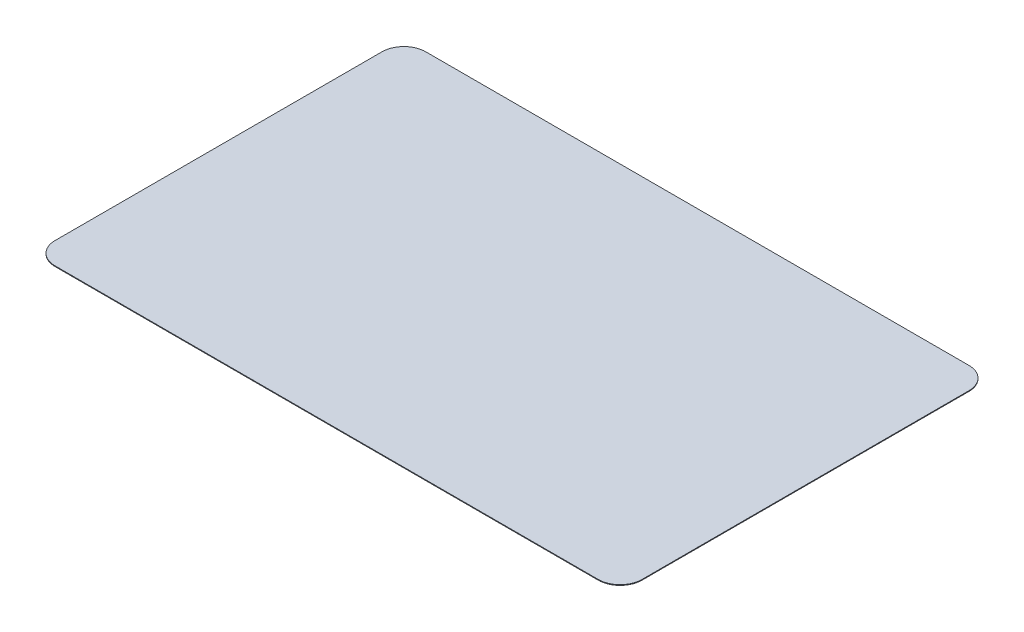
ISO-10303-21;
HEADER;
FILE_DESCRIPTION(('STEP AP214'),'2;1');
FILE_NAME('part.step','',(''),(''),'','','');
FILE_SCHEMA(('AUTOMOTIVE_DESIGN { 1 0 10303 214 1 1 1 1 }'));
ENDSEC;
DATA;
#1=APPLICATION_CONTEXT('core data for automotive mechanical design processes');
#2=APPLICATION_PROTOCOL_DEFINITION('international standard','automotive_design',2000,#1);
#3=PRODUCT_CONTEXT('',#1,'mechanical');
#4=PRODUCT('Part','Part','',(#3));
#5=PRODUCT_RELATED_PRODUCT_CATEGORY('part','',(#4));
#6=PRODUCT_DEFINITION_FORMATION('','',#4);
#7=PRODUCT_DEFINITION_CONTEXT('part definition',#1,'design');
#8=PRODUCT_DEFINITION('design','',#6,#7);
#9=PRODUCT_DEFINITION_SHAPE('','',#8);
#10=(LENGTH_UNIT() NAMED_UNIT(*) SI_UNIT(.MILLI.,.METRE.));
#11=(NAMED_UNIT(*) PLANE_ANGLE_UNIT() SI_UNIT($,.RADIAN.));
#12=(NAMED_UNIT(*) SI_UNIT($,.STERADIAN.) SOLID_ANGLE_UNIT());
#13=UNCERTAINTY_MEASURE_WITH_UNIT(LENGTH_MEASURE(1.E-05),#10,'distance_accuracy_value','');
#14=(GEOMETRIC_REPRESENTATION_CONTEXT(3) GLOBAL_UNCERTAINTY_ASSIGNED_CONTEXT((#13)) GLOBAL_UNIT_ASSIGNED_CONTEXT((#10,
#11,#12)) REPRESENTATION_CONTEXT('',''));
#15=CARTESIAN_POINT('',(0.,0.,0.));
#16=DIRECTION('',(0.,0.,1.));
#17=DIRECTION('',(1.,0.,0.));
#18=AXIS2_PLACEMENT_3D('',#15,#16,#17);
#19=CARTESIAN_POINT('',(-39.57,0.1,-23.82));
#20=DIRECTION('',(0.,-1.,0.));
#21=DIRECTION('',(0.,0.,-1.));
#22=AXIS2_PLACEMENT_3D('',#19,#20,#21);
#23=CYLINDRICAL_SURFACE('',#22,3.18);
#24=CARTESIAN_POINT('',(-39.57,0.,-23.82));
#25=DIRECTION('',(0.,1.,0.));
#26=DIRECTION('',(0.,0.,-1.));
#27=AXIS2_PLACEMENT_3D('',#24,#25,#26);
#28=CIRCLE('',#27,3.18);
#29=CARTESIAN_POINT('',(-39.57,0.,-27.));
#30=VERTEX_POINT('',#29);
#31=CARTESIAN_POINT('',(-42.75,0.,-23.82));
#32=VERTEX_POINT('',#31);
#33=EDGE_CURVE('E131',#30,#32,#28,.T.);
#34=ORIENTED_EDGE('',*,*,#33,.T.);
#35=DIRECTION('',(0.,-1.,0.));
#36=VECTOR('',#35,1.);
#37=CARTESIAN_POINT('',(-42.75,0.1,-23.82));
#38=LINE('',#37,#36);
#39=CARTESIAN_POINT('',(-42.75,0.1,-23.82));
#40=VERTEX_POINT('',#39);
#41=EDGE_CURVE('E11',#40,#32,#38,.T.);
#42=ORIENTED_EDGE('',*,*,#41,.F.);
#43=CARTESIAN_POINT('',(-39.57,0.1,-23.82));
#44=DIRECTION('',(0.,1.,0.));
#45=DIRECTION('',(0.,0.,-1.));
#46=AXIS2_PLACEMENT_3D('',#43,#44,#45);
#47=CIRCLE('',#46,3.18);
#48=CARTESIAN_POINT('',(-39.57,0.1,-27.));
#49=VERTEX_POINT('',#48);
#50=EDGE_CURVE('E145',#49,#40,#47,.T.);
#51=ORIENTED_EDGE('',*,*,#50,.F.);
#52=DIRECTION('',(0.,-1.,0.));
#53=VECTOR('',#52,1.);
#54=CARTESIAN_POINT('',(-39.57,0.1,-27.));
#55=LINE('',#54,#53);
#56=EDGE_CURVE('E127',#49,#30,#55,.T.);
#57=ORIENTED_EDGE('',*,*,#56,.T.);
#58=EDGE_LOOP('',(#34,#42,#51,#57));
#59=FACE_BOUND('',#58,.T.);
#60=ADVANCED_FACE('F35',(#59),#23,.T.);
#61=CARTESIAN_POINT('',(-42.75,0.1,23.82));
#62=DIRECTION('',(1.,0.,0.));
#63=DIRECTION('',(0.,0.,-1.));
#64=AXIS2_PLACEMENT_3D('',#61,#62,#63);
#65=PLANE('',#64);
#66=DIRECTION('',(0.,0.,1.));
#67=VECTOR('',#66,1.);
#68=CARTESIAN_POINT('',(-42.75,0.,23.82));
#69=LINE('',#68,#67);
#70=CARTESIAN_POINT('',(-42.75,0.,23.82));
#71=VERTEX_POINT('',#70);
#72=EDGE_CURVE('E134',#32,#71,#69,.T.);
#73=ORIENTED_EDGE('',*,*,#72,.T.);
#74=DIRECTION('',(0.,-1.,0.));
#75=VECTOR('',#74,1.);
#76=CARTESIAN_POINT('',(-42.75,0.1,23.82));
#77=LINE('',#76,#75);
#78=CARTESIAN_POINT('',(-42.75,0.1,23.82));
#79=VERTEX_POINT('',#78);
#80=EDGE_CURVE('E43',#79,#71,#77,.T.);
#81=ORIENTED_EDGE('',*,*,#80,.F.);
#82=DIRECTION('',(0.,0.,1.));
#83=VECTOR('',#82,1.);
#84=CARTESIAN_POINT('',(-42.75,0.1,23.82));
#85=LINE('',#84,#83);
#86=EDGE_CURVE('E94',#40,#79,#85,.T.);
#87=ORIENTED_EDGE('',*,*,#86,.F.);
#88=ORIENTED_EDGE('',*,*,#41,.T.);
#89=EDGE_LOOP('',(#73,#81,#87,#88));
#90=FACE_BOUND('',#89,.T.);
#91=ADVANCED_FACE('F180',(#90),#65,.F.);
#92=CARTESIAN_POINT('',(-39.57,0.1,23.82));
#93=DIRECTION('',(0.,-1.,0.));
#94=DIRECTION('',(0.,0.,-1.));
#95=AXIS2_PLACEMENT_3D('',#92,#93,#94);
#96=CYLINDRICAL_SURFACE('',#95,3.18);
#97=CARTESIAN_POINT('',(-39.57,0.,23.82));
#98=DIRECTION('',(0.,1.,0.));
#99=DIRECTION('',(0.,0.,-1.));
#100=AXIS2_PLACEMENT_3D('',#97,#98,#99);
#101=CIRCLE('',#100,3.18);
#102=CARTESIAN_POINT('',(-39.57,0.,27.));
#103=VERTEX_POINT('',#102);
#104=EDGE_CURVE('E136',#71,#103,#101,.T.);
#105=ORIENTED_EDGE('',*,*,#104,.T.);
#106=DIRECTION('',(0.,-1.,0.));
#107=VECTOR('',#106,1.);
#108=CARTESIAN_POINT('',(-39.57,0.1,27.));
#109=LINE('',#108,#107);
#110=CARTESIAN_POINT('',(-39.57,0.1,27.));
#111=VERTEX_POINT('',#110);
#112=EDGE_CURVE('E152',#111,#103,#109,.T.);
#113=ORIENTED_EDGE('',*,*,#112,.F.);
#114=CARTESIAN_POINT('',(-39.57,0.1,23.82));
#115=DIRECTION('',(0.,1.,0.));
#116=DIRECTION('',(0.,0.,-1.));
#117=AXIS2_PLACEMENT_3D('',#114,#115,#116);
#118=CIRCLE('',#117,3.18);
#119=EDGE_CURVE('E160',#79,#111,#118,.T.);
#120=ORIENTED_EDGE('',*,*,#119,.F.);
#121=ORIENTED_EDGE('',*,*,#80,.T.);
#122=EDGE_LOOP('',(#105,#113,#120,#121));
#123=FACE_BOUND('',#122,.T.);
#124=ADVANCED_FACE('F158',(#123),#96,.T.);
#125=CARTESIAN_POINT('',(-39.57,0.1,27.));
#126=DIRECTION('',(0.,0.,-1.));
#127=DIRECTION('',(-1.,0.,0.));
#128=AXIS2_PLACEMENT_3D('',#125,#126,#127);
#129=PLANE('',#128);
#130=DIRECTION('',(1.,0.,0.));
#131=VECTOR('',#130,1.);
#132=CARTESIAN_POINT('',(-39.57,0.,27.));
#133=LINE('',#132,#131);
#134=CARTESIAN_POINT('',(39.57,0.,27.));
#135=VERTEX_POINT('',#134);
#136=EDGE_CURVE('E138',#103,#135,#133,.T.);
#137=ORIENTED_EDGE('',*,*,#136,.T.);
#138=DIRECTION('',(0.,-1.,0.));
#139=VECTOR('',#138,1.);
#140=CARTESIAN_POINT('',(39.57,0.1,27.));
#141=LINE('',#140,#139);
#142=CARTESIAN_POINT('',(39.57,0.1,27.));
#143=VERTEX_POINT('',#142);
#144=EDGE_CURVE('E149',#143,#135,#141,.T.);
#145=ORIENTED_EDGE('',*,*,#144,.F.);
#146=DIRECTION('',(1.,0.,0.));
#147=VECTOR('',#146,1.);
#148=CARTESIAN_POINT('',(-39.57,0.1,27.));
#149=LINE('',#148,#147);
#150=EDGE_CURVE('E172',#111,#143,#149,.T.);
#151=ORIENTED_EDGE('',*,*,#150,.F.);
#152=ORIENTED_EDGE('',*,*,#112,.T.);
#153=EDGE_LOOP('',(#137,#145,#151,#152));
#154=FACE_BOUND('',#153,.T.);
#155=ADVANCED_FACE('F168',(#154),#129,.F.);
#156=CARTESIAN_POINT('',(39.57,0.1,23.82));
#157=DIRECTION('',(0.,-1.,0.));
#158=DIRECTION('',(0.,0.,-1.));
#159=AXIS2_PLACEMENT_3D('',#156,#157,#158);
#160=CYLINDRICAL_SURFACE('',#159,3.18);
#161=CARTESIAN_POINT('',(39.57,0.,23.82));
#162=DIRECTION('',(0.,1.,0.));
#163=DIRECTION('',(0.,0.,1.));
#164=AXIS2_PLACEMENT_3D('',#161,#162,#163);
#165=CIRCLE('',#164,3.18);
#166=CARTESIAN_POINT('',(42.75,0.,23.82));
#167=VERTEX_POINT('',#166);
#168=EDGE_CURVE('E140',#135,#167,#165,.T.);
#169=ORIENTED_EDGE('',*,*,#168,.T.);
#170=DIRECTION('',(0.,-1.,0.));
#171=VECTOR('',#170,1.);
#172=CARTESIAN_POINT('',(42.75,0.1,23.82));
#173=LINE('',#172,#171);
#174=CARTESIAN_POINT('',(42.75,0.1,23.82));
#175=VERTEX_POINT('',#174);
#176=EDGE_CURVE('E122',#175,#167,#173,.T.);
#177=ORIENTED_EDGE('',*,*,#176,.F.);
#178=CARTESIAN_POINT('',(39.57,0.1,23.82));
#179=DIRECTION('',(0.,1.,0.));
#180=DIRECTION('',(0.,0.,1.));
#181=AXIS2_PLACEMENT_3D('',#178,#179,#180);
#182=CIRCLE('',#181,3.18);
#183=EDGE_CURVE('E113',#143,#175,#182,.T.);
#184=ORIENTED_EDGE('',*,*,#183,.F.);
#185=ORIENTED_EDGE('',*,*,#144,.T.);
#186=EDGE_LOOP('',(#169,#177,#184,#185));
#187=FACE_BOUND('',#186,.T.);
#188=ADVANCED_FACE('F171',(#187),#160,.T.);
#189=CARTESIAN_POINT('',(42.75,0.1,23.82));
#190=DIRECTION('',(-1.,0.,0.));
#191=DIRECTION('',(0.,0.,1.));
#192=AXIS2_PLACEMENT_3D('',#189,#190,#191);
#193=PLANE('',#192);
#194=DIRECTION('',(0.,0.,-1.));
#195=VECTOR('',#194,1.);
#196=CARTESIAN_POINT('',(42.75,0.,23.82));
#197=LINE('',#196,#195);
#198=CARTESIAN_POINT('',(42.75,0.,-23.82));
#199=VERTEX_POINT('',#198);
#200=EDGE_CURVE('E121',#167,#199,#197,.T.);
#201=ORIENTED_EDGE('',*,*,#200,.T.);
#202=DIRECTION('',(0.,-1.,0.));
#203=VECTOR('',#202,1.);
#204=CARTESIAN_POINT('',(42.75,0.1,-23.82));
#205=LINE('',#204,#203);
#206=CARTESIAN_POINT('',(42.75,0.1,-23.82));
#207=VERTEX_POINT('',#206);
#208=EDGE_CURVE('E118',#207,#199,#205,.T.);
#209=ORIENTED_EDGE('',*,*,#208,.F.);
#210=DIRECTION('',(0.,0.,-1.));
#211=VECTOR('',#210,1.);
#212=CARTESIAN_POINT('',(42.75,0.1,23.82));
#213=LINE('',#212,#211);
#214=EDGE_CURVE('E107',#175,#207,#213,.T.);
#215=ORIENTED_EDGE('',*,*,#214,.F.);
#216=ORIENTED_EDGE('',*,*,#176,.T.);
#217=EDGE_LOOP('',(#201,#209,#215,#216));
#218=FACE_BOUND('',#217,.T.);
#219=ADVANCED_FACE('F119',(#218),#193,.F.);
#220=CARTESIAN_POINT('',(39.57,0.1,-23.82));
#221=DIRECTION('',(0.,-1.,0.));
#222=DIRECTION('',(0.,0.,-1.));
#223=AXIS2_PLACEMENT_3D('',#220,#221,#222);
#224=CYLINDRICAL_SURFACE('',#223,3.18);
#225=CARTESIAN_POINT('',(39.57,0.,-23.82));
#226=DIRECTION('',(0.,1.,0.));
#227=DIRECTION('',(0.,0.,-1.));
#228=AXIS2_PLACEMENT_3D('',#225,#226,#227);
#229=CIRCLE('',#228,3.18);
#230=CARTESIAN_POINT('',(39.57,0.,-27.));
#231=VERTEX_POINT('',#230);
#232=EDGE_CURVE('E80',#199,#231,#229,.T.);
#233=ORIENTED_EDGE('',*,*,#232,.T.);
#234=DIRECTION('',(0.,-1.,0.));
#235=VECTOR('',#234,1.);
#236=CARTESIAN_POINT('',(39.57,0.1,-27.));
#237=LINE('',#236,#235);
#238=CARTESIAN_POINT('',(39.57,0.1,-27.));
#239=VERTEX_POINT('',#238);
#240=EDGE_CURVE('E123',#239,#231,#237,.T.);
#241=ORIENTED_EDGE('',*,*,#240,.F.);
#242=CARTESIAN_POINT('',(39.57,0.1,-23.82));
#243=DIRECTION('',(0.,1.,0.));
#244=DIRECTION('',(0.,0.,-1.));
#245=AXIS2_PLACEMENT_3D('',#242,#243,#244);
#246=CIRCLE('',#245,3.18);
#247=EDGE_CURVE('E111',#207,#239,#246,.T.);
#248=ORIENTED_EDGE('',*,*,#247,.F.);
#249=ORIENTED_EDGE('',*,*,#208,.T.);
#250=EDGE_LOOP('',(#233,#241,#248,#249));
#251=FACE_BOUND('',#250,.T.);
#252=ADVANCED_FACE('F125',(#251),#224,.T.);
#253=CARTESIAN_POINT('',(-39.57,0.1,-27.));
#254=DIRECTION('',(0.,0.,1.));
#255=DIRECTION('',(1.,0.,0.));
#256=AXIS2_PLACEMENT_3D('',#253,#254,#255);
#257=PLANE('',#256);
#258=DIRECTION('',(-1.,0.,0.));
#259=VECTOR('',#258,1.);
#260=CARTESIAN_POINT('',(-39.57,0.,-27.));
#261=LINE('',#260,#259);
#262=EDGE_CURVE('E86',#231,#30,#261,.T.);
#263=ORIENTED_EDGE('',*,*,#262,.T.);
#264=ORIENTED_EDGE('',*,*,#56,.F.);
#265=DIRECTION('',(-1.,0.,0.));
#266=VECTOR('',#265,1.);
#267=CARTESIAN_POINT('',(-39.57,0.1,-27.));
#268=LINE('',#267,#266);
#269=EDGE_CURVE('E51',#239,#49,#268,.T.);
#270=ORIENTED_EDGE('',*,*,#269,.F.);
#271=ORIENTED_EDGE('',*,*,#240,.T.);
#272=EDGE_LOOP('',(#263,#264,#270,#271));
#273=FACE_BOUND('',#272,.T.);
#274=ADVANCED_FACE('F196',(#273),#257,.F.);
#275=CARTESIAN_POINT('',(-39.57,0.1,-23.82));
#276=DIRECTION('',(0.,-1.,0.));
#277=DIRECTION('',(0.,0.,-1.));
#278=AXIS2_PLACEMENT_3D('',#275,#276,#277);
#279=PLANE('',#278);
#280=ORIENTED_EDGE('',*,*,#50,.T.);
#281=ORIENTED_EDGE('',*,*,#86,.T.);
#282=ORIENTED_EDGE('',*,*,#119,.T.);
#283=ORIENTED_EDGE('',*,*,#150,.T.);
#284=ORIENTED_EDGE('',*,*,#183,.T.);
#285=ORIENTED_EDGE('',*,*,#214,.T.);
#286=ORIENTED_EDGE('',*,*,#247,.T.);
#287=ORIENTED_EDGE('',*,*,#269,.T.);
#288=EDGE_LOOP('',(#280,#281,#282,#283,#284,#285,#286,#287));
#289=FACE_BOUND('',#288,.T.);
#290=ADVANCED_FACE('F109',(#289),#279,.F.);
#291=CARTESIAN_POINT('',(-39.57,0.,-23.82));
#292=DIRECTION('',(0.,-1.,0.));
#293=DIRECTION('',(0.,0.,-1.));
#294=AXIS2_PLACEMENT_3D('',#291,#292,#293);
#295=PLANE('',#294);
#296=ORIENTED_EDGE('',*,*,#33,.F.);
#297=ORIENTED_EDGE('',*,*,#262,.F.);
#298=ORIENTED_EDGE('',*,*,#232,.F.);
#299=ORIENTED_EDGE('',*,*,#200,.F.);
#300=ORIENTED_EDGE('',*,*,#168,.F.);
#301=ORIENTED_EDGE('',*,*,#136,.F.);
#302=ORIENTED_EDGE('',*,*,#104,.F.);
#303=ORIENTED_EDGE('',*,*,#72,.F.);
#304=EDGE_LOOP('',(#296,#297,#298,#299,#300,#301,#302,#303));
#305=FACE_BOUND('',#304,.T.);
#306=ADVANCED_FACE('F164',(#305),#295,.T.);
#307=CLOSED_SHELL('',(#60,#91,#124,#155,#188,#219,#252,#274,#290,#306));
#308=MANIFOLD_SOLID_BREP('B2',#307);
#309=ADVANCED_BREP_SHAPE_REPRESENTATION('',(#18,#308),#14);
#310=SHAPE_DEFINITION_REPRESENTATION(#9,#309);
ENDSEC;
END-ISO-10303-21;
